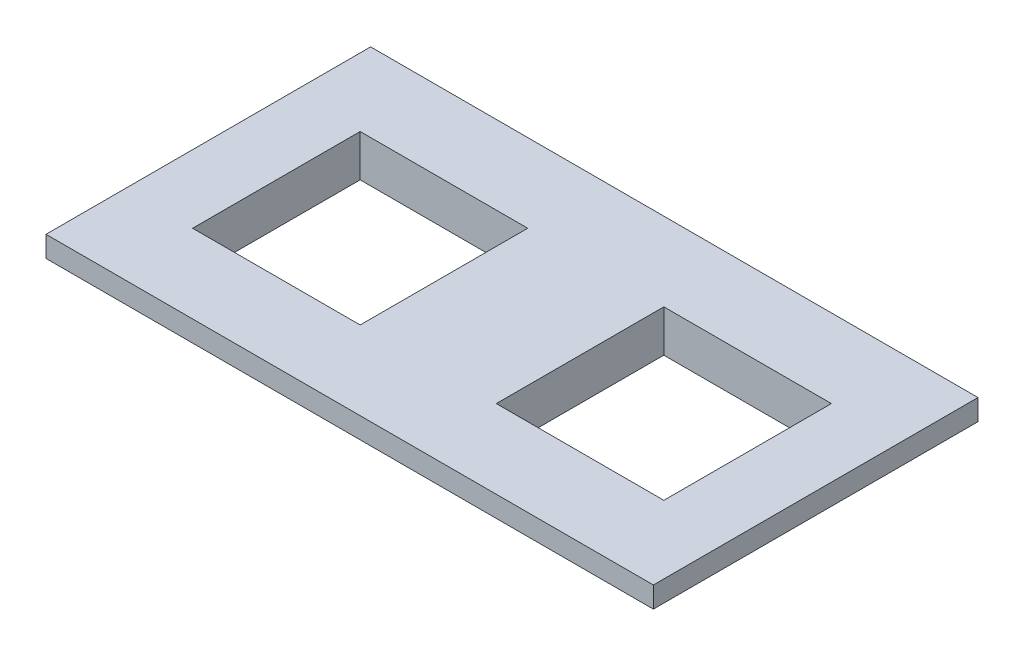
ISO-10303-21;
HEADER;
FILE_DESCRIPTION(('STEP AP214'),'2;1');
FILE_NAME('part.step','',(''),(''),'','','');
FILE_SCHEMA(('AUTOMOTIVE_DESIGN { 1 0 10303 214 1 1 1 1 }'));
ENDSEC;
DATA;
#1=APPLICATION_CONTEXT('core data for automotive mechanical design processes');
#2=APPLICATION_PROTOCOL_DEFINITION('international standard','automotive_design',2000,#1);
#3=PRODUCT_CONTEXT('',#1,'mechanical');
#4=PRODUCT('Part','Part','',(#3));
#5=PRODUCT_RELATED_PRODUCT_CATEGORY('part','',(#4));
#6=PRODUCT_DEFINITION_FORMATION('','',#4);
#7=PRODUCT_DEFINITION_CONTEXT('part definition',#1,'design');
#8=PRODUCT_DEFINITION('design','',#6,#7);
#9=PRODUCT_DEFINITION_SHAPE('','',#8);
#10=(LENGTH_UNIT() NAMED_UNIT(*) SI_UNIT(.MILLI.,.METRE.));
#11=(NAMED_UNIT(*) PLANE_ANGLE_UNIT() SI_UNIT($,.RADIAN.));
#12=(NAMED_UNIT(*) SI_UNIT($,.STERADIAN.) SOLID_ANGLE_UNIT());
#13=UNCERTAINTY_MEASURE_WITH_UNIT(LENGTH_MEASURE(1.E-05),#10,'distance_accuracy_value','');
#14=(GEOMETRIC_REPRESENTATION_CONTEXT(3) GLOBAL_UNCERTAINTY_ASSIGNED_CONTEXT((#13)) GLOBAL_UNIT_ASSIGNED_CONTEXT((#10,
#11,#12)) REPRESENTATION_CONTEXT('',''));
#15=CARTESIAN_POINT('',(0.,0.,0.));
#16=DIRECTION('',(0.,0.,1.));
#17=DIRECTION('',(1.,0.,0.));
#18=AXIS2_PLACEMENT_3D('',#15,#16,#17);
#19=CARTESIAN_POINT('',(-13.5,8.,7.75));
#20=DIRECTION('',(1.,0.,0.));
#21=DIRECTION('',(0.,0.,-1.));
#22=AXIS2_PLACEMENT_3D('',#19,#20,#21);
#23=PLANE('',#22);
#24=DIRECTION('',(0.,-1.,0.));
#25=VECTOR('',#24,1.);
#26=CARTESIAN_POINT('',(-13.5,8.,6.75));
#27=LINE('',#26,#25);
#28=CARTESIAN_POINT('',(-13.5,8.,6.75));
#29=VERTEX_POINT('',#28);
#30=CARTESIAN_POINT('',(-13.5,7.,6.75));
#31=VERTEX_POINT('',#30);
#32=EDGE_CURVE('E305',#29,#31,#27,.T.);
#33=ORIENTED_EDGE('',*,*,#32,.F.);
#34=DIRECTION('',(0.,0.,1.));
#35=VECTOR('',#34,1.);
#36=CARTESIAN_POINT('',(-13.5,8.,0.));
#37=LINE('',#36,#35);
#38=CARTESIAN_POINT('',(-13.5,8.,-6.75));
#39=VERTEX_POINT('',#38);
#40=EDGE_CURVE('E304',#39,#29,#37,.T.);
#41=ORIENTED_EDGE('',*,*,#40,.F.);
#42=DIRECTION('',(0.,-1.,0.));
#43=VECTOR('',#42,1.);
#44=CARTESIAN_POINT('',(-13.5,8.,-6.75));
#45=LINE('',#44,#43);
#46=CARTESIAN_POINT('',(-13.5,7.,-6.75));
#47=VERTEX_POINT('',#46);
#48=EDGE_CURVE('E311',#39,#47,#45,.T.);
#49=ORIENTED_EDGE('',*,*,#48,.T.);
#50=DIRECTION('',(0.,0.,-1.));
#51=VECTOR('',#50,1.);
#52=CARTESIAN_POINT('',(-13.5,7.,7.75));
#53=LINE('',#52,#51);
#54=EDGE_CURVE('E61',#31,#47,#53,.T.);
#55=ORIENTED_EDGE('',*,*,#54,.F.);
#56=EDGE_LOOP('',(#33,#41,#49,#55));
#57=FACE_BOUND('',#56,.T.);
#58=ADVANCED_FACE('F57',(#57),#23,.F.);
#59=CARTESIAN_POINT('',(13.5,8.,7.75000000000001));
#60=DIRECTION('',(-1.,0.,0.));
#61=DIRECTION('',(0.,0.,1.));
#62=AXIS2_PLACEMENT_3D('',#59,#60,#61);
#63=PLANE('',#62);
#64=DIRECTION('',(0.,-1.,0.));
#65=VECTOR('',#64,1.);
#66=CARTESIAN_POINT('',(13.5,8.,-6.75000000000001));
#67=LINE('',#66,#65);
#68=CARTESIAN_POINT('',(13.5,8.,-6.75000000000001));
#69=VERTEX_POINT('',#68);
#70=CARTESIAN_POINT('',(13.5,7.,-6.75000000000001));
#71=VERTEX_POINT('',#70);
#72=EDGE_CURVE('E316',#69,#71,#67,.T.);
#73=ORIENTED_EDGE('',*,*,#72,.F.);
#74=DIRECTION('',(0.,0.,-1.));
#75=VECTOR('',#74,1.);
#76=CARTESIAN_POINT('',(13.5,8.,0.));
#77=LINE('',#76,#75);
#78=CARTESIAN_POINT('',(13.5,8.,6.75000000000001));
#79=VERTEX_POINT('',#78);
#80=EDGE_CURVE('E331',#79,#69,#77,.T.);
#81=ORIENTED_EDGE('',*,*,#80,.F.);
#82=DIRECTION('',(0.,-1.,0.));
#83=VECTOR('',#82,1.);
#84=CARTESIAN_POINT('',(13.5,8.,6.75000000000001));
#85=LINE('',#84,#83);
#86=CARTESIAN_POINT('',(13.5,7.,6.75000000000001));
#87=VERTEX_POINT('',#86);
#88=EDGE_CURVE('E309',#79,#87,#85,.T.);
#89=ORIENTED_EDGE('',*,*,#88,.T.);
#90=DIRECTION('',(0.,0.,1.));
#91=VECTOR('',#90,1.);
#92=CARTESIAN_POINT('',(13.5,7.,7.75000000000001));
#93=LINE('',#92,#91);
#94=EDGE_CURVE('E353',#71,#87,#93,.T.);
#95=ORIENTED_EDGE('',*,*,#94,.F.);
#96=EDGE_LOOP('',(#73,#81,#89,#95));
#97=FACE_BOUND('',#96,.T.);
#98=ADVANCED_FACE('F439',(#97),#63,.F.);
#99=CARTESIAN_POINT('',(-0.500000000000001,8.,-6.75));
#100=DIRECTION('',(1.,0.,0.));
#101=DIRECTION('',(0.,0.,-1.));
#102=AXIS2_PLACEMENT_3D('',#99,#100,#101);
#103=PLANE('',#102);
#104=DIRECTION('',(0.,0.,-1.));
#105=VECTOR('',#104,1.);
#106=CARTESIAN_POINT('',(-0.500000000000001,7.,-6.75));
#107=LINE('',#106,#105);
#108=CARTESIAN_POINT('',(-0.499999999999999,7.,6.75));
#109=VERTEX_POINT('',#108);
#110=CARTESIAN_POINT('',(-0.500000000000001,7.,-6.75));
#111=VERTEX_POINT('',#110);
#112=EDGE_CURVE('E356',#109,#111,#107,.T.);
#113=ORIENTED_EDGE('',*,*,#112,.T.);
#114=DIRECTION('',(0.,-1.,0.));
#115=VECTOR('',#114,1.);
#116=CARTESIAN_POINT('',(-0.500000000000001,8.,-6.75));
#117=LINE('',#116,#115);
#118=CARTESIAN_POINT('',(-0.5,8.,-6.75));
#119=VERTEX_POINT('',#118);
#120=EDGE_CURVE('E300',#119,#111,#117,.T.);
#121=ORIENTED_EDGE('',*,*,#120,.F.);
#122=DIRECTION('',(0.,0.,1.));
#123=VECTOR('',#122,1.);
#124=CARTESIAN_POINT('',(-0.500000000000001,8.,-6.75));
#125=LINE('',#124,#123);
#126=CARTESIAN_POINT('',(-0.5,8.,6.75));
#127=VERTEX_POINT('',#126);
#128=EDGE_CURVE('E11',#119,#127,#125,.T.);
#129=ORIENTED_EDGE('',*,*,#128,.T.);
#130=DIRECTION('',(0.,-1.,0.));
#131=VECTOR('',#130,1.);
#132=CARTESIAN_POINT('',(-0.499999999999999,8.,6.75));
#133=LINE('',#132,#131);
#134=EDGE_CURVE('E296',#127,#109,#133,.T.);
#135=ORIENTED_EDGE('',*,*,#134,.T.);
#136=EDGE_LOOP('',(#113,#121,#129,#135));
#137=FACE_BOUND('',#136,.T.);
#138=ADVANCED_FACE('F418',(#137),#103,.T.);
#139=CARTESIAN_POINT('',(-14.5,8.,6.75));
#140=DIRECTION('',(0.,0.,-1.));
#141=DIRECTION('',(-1.,0.,0.));
#142=AXIS2_PLACEMENT_3D('',#139,#140,#141);
#143=PLANE('',#142);
#144=ORIENTED_EDGE('',*,*,#134,.F.);
#145=DIRECTION('',(1.,0.,0.));
#146=VECTOR('',#145,1.);
#147=CARTESIAN_POINT('',(0.,8.,6.75));
#148=LINE('',#147,#146);
#149=EDGE_CURVE('E330',#29,#127,#148,.T.);
#150=ORIENTED_EDGE('',*,*,#149,.F.);
#151=ORIENTED_EDGE('',*,*,#32,.T.);
#152=DIRECTION('',(-1.,0.,0.));
#153=VECTOR('',#152,1.);
#154=CARTESIAN_POINT('',(-14.5,7.,6.75));
#155=LINE('',#154,#153);
#156=EDGE_CURVE('E393',#109,#31,#155,.T.);
#157=ORIENTED_EDGE('',*,*,#156,.F.);
#158=EDGE_LOOP('',(#144,#150,#151,#157));
#159=FACE_BOUND('',#158,.T.);
#160=ADVANCED_FACE('F408',(#159),#143,.F.);
#161=CARTESIAN_POINT('',(0.5,8.,-6.75000000000001));
#162=DIRECTION('',(-1.,0.,0.));
#163=DIRECTION('',(0.,0.,1.));
#164=AXIS2_PLACEMENT_3D('',#161,#162,#163);
#165=PLANE('',#164);
#166=DIRECTION('',(0.,0.,1.));
#167=VECTOR('',#166,1.);
#168=CARTESIAN_POINT('',(0.5,7.,-6.75000000000001));
#169=LINE('',#168,#167);
#170=CARTESIAN_POINT('',(0.5,7.,-6.75000000000001));
#171=VERTEX_POINT('',#170);
#172=CARTESIAN_POINT('',(0.500000000000001,7.,6.75));
#173=VERTEX_POINT('',#172);
#174=EDGE_CURVE('E310',#171,#173,#169,.T.);
#175=ORIENTED_EDGE('',*,*,#174,.T.);
#176=DIRECTION('',(0.,-1.,0.));
#177=VECTOR('',#176,1.);
#178=CARTESIAN_POINT('',(0.500000000000001,8.,6.75));
#179=LINE('',#178,#177);
#180=CARTESIAN_POINT('',(0.500000000000002,8.,6.75));
#181=VERTEX_POINT('',#180);
#182=EDGE_CURVE('E292',#181,#173,#179,.T.);
#183=ORIENTED_EDGE('',*,*,#182,.F.);
#184=DIRECTION('',(0.,0.,-1.));
#185=VECTOR('',#184,1.);
#186=CARTESIAN_POINT('',(0.5,8.,-6.75000000000001));
#187=LINE('',#186,#185);
#188=CARTESIAN_POINT('',(0.500000000000002,8.,-6.75));
#189=VERTEX_POINT('',#188);
#190=EDGE_CURVE('E67',#181,#189,#187,.T.);
#191=ORIENTED_EDGE('',*,*,#190,.T.);
#192=DIRECTION('',(0.,-1.,0.));
#193=VECTOR('',#192,1.);
#194=CARTESIAN_POINT('',(0.5,8.,-6.75000000000001));
#195=LINE('',#194,#193);
#196=EDGE_CURVE('E288',#189,#171,#195,.T.);
#197=ORIENTED_EDGE('',*,*,#196,.T.);
#198=EDGE_LOOP('',(#175,#183,#191,#197));
#199=FACE_BOUND('',#198,.T.);
#200=ADVANCED_FACE('F432',(#199),#165,.T.);
#201=CARTESIAN_POINT('',(-14.5,8.,-6.75));
#202=DIRECTION('',(0.,0.,1.));
#203=DIRECTION('',(1.,0.,0.));
#204=AXIS2_PLACEMENT_3D('',#201,#202,#203);
#205=PLANE('',#204);
#206=ORIENTED_EDGE('',*,*,#196,.F.);
#207=DIRECTION('',(-1.,0.,0.));
#208=VECTOR('',#207,1.);
#209=CARTESIAN_POINT('',(0.,8.,-6.75));
#210=LINE('',#209,#208);
#211=EDGE_CURVE('E315',#69,#189,#210,.T.);
#212=ORIENTED_EDGE('',*,*,#211,.F.);
#213=ORIENTED_EDGE('',*,*,#72,.T.);
#214=DIRECTION('',(1.,0.,0.));
#215=VECTOR('',#214,1.);
#216=CARTESIAN_POINT('',(-14.5,7.,-6.75));
#217=LINE('',#216,#215);
#218=EDGE_CURVE('E384',#171,#71,#217,.T.);
#219=ORIENTED_EDGE('',*,*,#218,.F.);
#220=EDGE_LOOP('',(#206,#212,#213,#219));
#221=FACE_BOUND('',#220,.T.);
#222=ADVANCED_FACE('F429',(#221),#205,.F.);
#223=CARTESIAN_POINT('',(0.,8.,0.));
#224=DIRECTION('',(0.,-1.,0.));
#225=DIRECTION('',(0.,0.,-1.));
#226=AXIS2_PLACEMENT_3D('',#223,#224,#225);
#227=PLANE('',#226);
#228=EDGE_CURVE('E326',#181,#79,#148,.T.);
#229=ORIENTED_EDGE('',*,*,#228,.T.);
#230=ORIENTED_EDGE('',*,*,#80,.T.);
#231=ORIENTED_EDGE('',*,*,#211,.T.);
#232=ORIENTED_EDGE('',*,*,#190,.F.);
#233=EDGE_LOOP('',(#229,#230,#231,#232));
#234=FACE_BOUND('',#233,.T.);
#235=DIRECTION('',(0.,0.,1.));
#236=VECTOR('',#235,1.);
#237=CARTESIAN_POINT('',(-14.5,8.,7.75));
#238=LINE('',#237,#236);
#239=CARTESIAN_POINT('',(-14.5,8.,-7.75));
#240=VERTEX_POINT('',#239);
#241=CARTESIAN_POINT('',(-14.5,8.,7.75));
#242=VERTEX_POINT('',#241);
#243=EDGE_CURVE('E339',#240,#242,#238,.T.);
#244=ORIENTED_EDGE('',*,*,#243,.F.);
#245=DIRECTION('',(-1.,0.,0.));
#246=VECTOR('',#245,1.);
#247=CARTESIAN_POINT('',(-14.5,8.,-7.75));
#248=LINE('',#247,#246);
#249=CARTESIAN_POINT('',(14.5,8.,-7.75000000000001));
#250=VERTEX_POINT('',#249);
#251=EDGE_CURVE('E350',#250,#240,#248,.T.);
#252=ORIENTED_EDGE('',*,*,#251,.F.);
#253=DIRECTION('',(0.,0.,-1.));
#254=VECTOR('',#253,1.);
#255=CARTESIAN_POINT('',(14.5,8.,7.75000000000001));
#256=LINE('',#255,#254);
#257=CARTESIAN_POINT('',(14.5,8.,7.75000000000001));
#258=VERTEX_POINT('',#257);
#259=EDGE_CURVE('E347',#258,#250,#256,.T.);
#260=ORIENTED_EDGE('',*,*,#259,.F.);
#261=DIRECTION('',(1.,0.,0.));
#262=VECTOR('',#261,1.);
#263=CARTESIAN_POINT('',(-14.5,8.,7.75));
#264=LINE('',#263,#262);
#265=EDGE_CURVE('E343',#242,#258,#264,.T.);
#266=ORIENTED_EDGE('',*,*,#265,.F.);
#267=EDGE_LOOP('',(#244,#252,#260,#266));
#268=FACE_BOUND('',#267,.T.);
#269=ORIENTED_EDGE('',*,*,#40,.T.);
#270=ORIENTED_EDGE('',*,*,#149,.T.);
#271=ORIENTED_EDGE('',*,*,#128,.F.);
#272=EDGE_CURVE('E335',#119,#39,#210,.T.);
#273=ORIENTED_EDGE('',*,*,#272,.T.);
#274=EDGE_LOOP('',(#269,#270,#271,#273));
#275=FACE_BOUND('',#274,.T.);
#276=ADVANCED_FACE('F420',(#234,#268,#275),#227,.T.);
#277=ORIENTED_EDGE('',*,*,#88,.F.);
#278=ORIENTED_EDGE('',*,*,#228,.F.);
#279=ORIENTED_EDGE('',*,*,#182,.T.);
#280=DIRECTION('',(-1.,0.,0.));
#281=VECTOR('',#280,1.);
#282=CARTESIAN_POINT('',(-14.5,7.,6.75));
#283=LINE('',#282,#281);
#284=EDGE_CURVE('E389',#87,#173,#283,.T.);
#285=ORIENTED_EDGE('',*,*,#284,.F.);
#286=EDGE_LOOP('',(#277,#278,#279,#285));
#287=FACE_BOUND('',#286,.T.);
#288=ADVANCED_FACE('F437',(#287),#143,.F.);
#289=ORIENTED_EDGE('',*,*,#48,.F.);
#290=ORIENTED_EDGE('',*,*,#272,.F.);
#291=ORIENTED_EDGE('',*,*,#120,.T.);
#292=DIRECTION('',(1.,0.,0.));
#293=VECTOR('',#292,1.);
#294=CARTESIAN_POINT('',(-14.5,7.,-6.75));
#295=LINE('',#294,#293);
#296=EDGE_CURVE('E388',#47,#111,#295,.T.);
#297=ORIENTED_EDGE('',*,*,#296,.F.);
#298=EDGE_LOOP('',(#289,#290,#291,#297));
#299=FACE_BOUND('',#298,.T.);
#300=ADVANCED_FACE('F415',(#299),#205,.F.);
#301=CARTESIAN_POINT('',(-14.5,7.,-7.75));
#302=DIRECTION('',(0.,-1.,0.));
#303=DIRECTION('',(0.,0.,-1.));
#304=AXIS2_PLACEMENT_3D('',#301,#302,#303);
#305=PLANE('',#304);
#306=DIRECTION('',(0.,0.,1.));
#307=VECTOR('',#306,1.);
#308=CARTESIAN_POINT('',(11.25,7.,-7.75));
#309=LINE('',#308,#307);
#310=CARTESIAN_POINT('',(11.25,7.,-4.));
#311=VERTEX_POINT('',#310);
#312=CARTESIAN_POINT('',(11.25,7.,4.));
#313=VERTEX_POINT('',#312);
#314=EDGE_CURVE('E270',#311,#313,#309,.T.);
#315=ORIENTED_EDGE('',*,*,#314,.F.);
#316=DIRECTION('',(1.,0.,0.));
#317=VECTOR('',#316,1.);
#318=CARTESIAN_POINT('',(-14.5,7.,-4.));
#319=LINE('',#318,#317);
#320=CARTESIAN_POINT('',(3.25,7.,-4.));
#321=VERTEX_POINT('',#320);
#322=EDGE_CURVE('E231',#321,#311,#319,.T.);
#323=ORIENTED_EDGE('',*,*,#322,.F.);
#324=DIRECTION('',(0.,0.,-1.));
#325=VECTOR('',#324,1.);
#326=CARTESIAN_POINT('',(3.25,7.,-7.75));
#327=LINE('',#326,#325);
#328=CARTESIAN_POINT('',(3.25,7.,4.));
#329=VERTEX_POINT('',#328);
#330=EDGE_CURVE('E264',#329,#321,#327,.T.);
#331=ORIENTED_EDGE('',*,*,#330,.F.);
#332=DIRECTION('',(-1.,0.,0.));
#333=VECTOR('',#332,1.);
#334=CARTESIAN_POINT('',(-14.5,7.,4.));
#335=LINE('',#334,#333);
#336=EDGE_CURVE('E267',#313,#329,#335,.T.);
#337=ORIENTED_EDGE('',*,*,#336,.F.);
#338=EDGE_LOOP('',(#315,#323,#331,#337));
#339=FACE_BOUND('',#338,.T.);
#340=ORIENTED_EDGE('',*,*,#218,.T.);
#341=ORIENTED_EDGE('',*,*,#94,.T.);
#342=ORIENTED_EDGE('',*,*,#284,.T.);
#343=ORIENTED_EDGE('',*,*,#174,.F.);
#344=EDGE_LOOP('',(#340,#341,#342,#343));
#345=FACE_BOUND('',#344,.T.);
#346=ADVANCED_FACE('F441',(#339,#345),#305,.T.);
#347=DIRECTION('',(0.,0.,1.));
#348=VECTOR('',#347,1.);
#349=CARTESIAN_POINT('',(-3.25,7.,-7.75));
#350=LINE('',#349,#348);
#351=CARTESIAN_POINT('',(-3.25,7.,-4.));
#352=VERTEX_POINT('',#351);
#353=CARTESIAN_POINT('',(-3.25,7.,4.));
#354=VERTEX_POINT('',#353);
#355=EDGE_CURVE('E281',#352,#354,#350,.T.);
#356=ORIENTED_EDGE('',*,*,#355,.F.);
#357=DIRECTION('',(1.,0.,0.));
#358=VECTOR('',#357,1.);
#359=CARTESIAN_POINT('',(-14.5,7.,-4.));
#360=LINE('',#359,#358);
#361=CARTESIAN_POINT('',(-11.25,7.,-4.));
#362=VERTEX_POINT('',#361);
#363=EDGE_CURVE('E273',#362,#352,#360,.T.);
#364=ORIENTED_EDGE('',*,*,#363,.F.);
#365=DIRECTION('',(0.,0.,-1.));
#366=VECTOR('',#365,1.);
#367=CARTESIAN_POINT('',(-11.25,7.,-7.75));
#368=LINE('',#367,#366);
#369=CARTESIAN_POINT('',(-11.25,7.,4.));
#370=VERTEX_POINT('',#369);
#371=EDGE_CURVE('E202',#370,#362,#368,.T.);
#372=ORIENTED_EDGE('',*,*,#371,.F.);
#373=DIRECTION('',(-1.,0.,0.));
#374=VECTOR('',#373,1.);
#375=CARTESIAN_POINT('',(-14.5,7.,4.));
#376=LINE('',#375,#374);
#377=EDGE_CURVE('E278',#354,#370,#376,.T.);
#378=ORIENTED_EDGE('',*,*,#377,.F.);
#379=EDGE_LOOP('',(#356,#364,#372,#378));
#380=FACE_BOUND('',#379,.T.);
#381=ORIENTED_EDGE('',*,*,#156,.T.);
#382=ORIENTED_EDGE('',*,*,#54,.T.);
#383=ORIENTED_EDGE('',*,*,#296,.T.);
#384=ORIENTED_EDGE('',*,*,#112,.F.);
#385=EDGE_LOOP('',(#381,#382,#383,#384));
#386=FACE_BOUND('',#385,.T.);
#387=ADVANCED_FACE('F404',(#380,#386),#305,.T.);
#388=CARTESIAN_POINT('',(0.,0.,7.75));
#389=DIRECTION('',(0.,0.,1.));
#390=DIRECTION('',(1.,0.,0.));
#391=AXIS2_PLACEMENT_3D('',#388,#389,#390);
#392=PLANE('',#391);
#393=DIRECTION('',(0.,-1.,0.));
#394=VECTOR('',#393,1.);
#395=CARTESIAN_POINT('',(-14.5,9.,7.75));
#396=LINE('',#395,#394);
#397=CARTESIAN_POINT('',(-14.5,9.,7.75));
#398=VERTEX_POINT('',#397);
#399=EDGE_CURVE('E283',#398,#242,#396,.T.);
#400=ORIENTED_EDGE('',*,*,#399,.T.);
#401=ORIENTED_EDGE('',*,*,#265,.T.);
#402=DIRECTION('',(0.,1.,0.));
#403=VECTOR('',#402,1.);
#404=CARTESIAN_POINT('',(14.5,9.,7.75));
#405=LINE('',#404,#403);
#406=CARTESIAN_POINT('',(14.5,9.,7.75));
#407=VERTEX_POINT('',#406);
#408=EDGE_CURVE('E373',#258,#407,#405,.T.);
#409=ORIENTED_EDGE('',*,*,#408,.T.);
#410=DIRECTION('',(-1.,0.,0.));
#411=VECTOR('',#410,1.);
#412=CARTESIAN_POINT('',(-14.5,9.,7.75));
#413=LINE('',#412,#411);
#414=EDGE_CURVE('E362',#407,#398,#413,.T.);
#415=ORIENTED_EDGE('',*,*,#414,.T.);
#416=EDGE_LOOP('',(#400,#401,#409,#415));
#417=FACE_BOUND('',#416,.T.);
#418=ADVANCED_FACE('F449',(#417),#392,.T.);
#419=CARTESIAN_POINT('',(-14.5,9.,-7.75));
#420=DIRECTION('',(0.,1.,0.));
#421=DIRECTION('',(0.,0.,1.));
#422=AXIS2_PLACEMENT_3D('',#419,#420,#421);
#423=PLANE('',#422);
#424=DIRECTION('',(0.,0.,-1.));
#425=VECTOR('',#424,1.);
#426=CARTESIAN_POINT('',(-3.25,9.,4.));
#427=LINE('',#426,#425);
#428=CARTESIAN_POINT('',(-3.25,9.,4.));
#429=VERTEX_POINT('',#428);
#430=CARTESIAN_POINT('',(-3.25,9.,-4.));
#431=VERTEX_POINT('',#430);
#432=EDGE_CURVE('E216',#429,#431,#427,.T.);
#433=ORIENTED_EDGE('',*,*,#432,.F.);
#434=DIRECTION('',(1.,0.,0.));
#435=VECTOR('',#434,1.);
#436=CARTESIAN_POINT('',(-11.25,9.,4.));
#437=LINE('',#436,#435);
#438=CARTESIAN_POINT('',(-11.25,9.,4.));
#439=VERTEX_POINT('',#438);
#440=EDGE_CURVE('E221',#439,#429,#437,.T.);
#441=ORIENTED_EDGE('',*,*,#440,.F.);
#442=DIRECTION('',(0.,0.,1.));
#443=VECTOR('',#442,1.);
#444=CARTESIAN_POINT('',(-11.25,9.,4.));
#445=LINE('',#444,#443);
#446=CARTESIAN_POINT('',(-11.25,9.,-4.));
#447=VERTEX_POINT('',#446);
#448=EDGE_CURVE('E199',#447,#439,#445,.T.);
#449=ORIENTED_EDGE('',*,*,#448,.F.);
#450=DIRECTION('',(-1.,0.,0.));
#451=VECTOR('',#450,1.);
#452=CARTESIAN_POINT('',(-11.25,9.,-4.));
#453=LINE('',#452,#451);
#454=EDGE_CURVE('E210',#431,#447,#453,.T.);
#455=ORIENTED_EDGE('',*,*,#454,.F.);
#456=EDGE_LOOP('',(#433,#441,#449,#455));
#457=FACE_BOUND('',#456,.T.);
#458=DIRECTION('',(0.,0.,-1.));
#459=VECTOR('',#458,1.);
#460=CARTESIAN_POINT('',(11.25,9.,4.));
#461=LINE('',#460,#459);
#462=CARTESIAN_POINT('',(11.25,9.,4.));
#463=VERTEX_POINT('',#462);
#464=CARTESIAN_POINT('',(11.25,9.,-4.));
#465=VERTEX_POINT('',#464);
#466=EDGE_CURVE('E236',#463,#465,#461,.T.);
#467=ORIENTED_EDGE('',*,*,#466,.F.);
#468=DIRECTION('',(1.,0.,0.));
#469=VECTOR('',#468,1.);
#470=CARTESIAN_POINT('',(3.25,9.,4.));
#471=LINE('',#470,#469);
#472=CARTESIAN_POINT('',(3.25,9.,4.));
#473=VERTEX_POINT('',#472);
#474=EDGE_CURVE('E246',#473,#463,#471,.T.);
#475=ORIENTED_EDGE('',*,*,#474,.F.);
#476=DIRECTION('',(0.,0.,1.));
#477=VECTOR('',#476,1.);
#478=CARTESIAN_POINT('',(3.25,9.,4.));
#479=LINE('',#478,#477);
#480=CARTESIAN_POINT('',(3.25,9.,-4.));
#481=VERTEX_POINT('',#480);
#482=EDGE_CURVE('E242',#481,#473,#479,.T.);
#483=ORIENTED_EDGE('',*,*,#482,.F.);
#484=DIRECTION('',(-1.,0.,0.));
#485=VECTOR('',#484,1.);
#486=CARTESIAN_POINT('',(3.25,9.,-4.));
#487=LINE('',#486,#485);
#488=EDGE_CURVE('E239',#465,#481,#487,.T.);
#489=ORIENTED_EDGE('',*,*,#488,.F.);
#490=EDGE_LOOP('',(#467,#475,#483,#489));
#491=FACE_BOUND('',#490,.T.);
#492=ORIENTED_EDGE('',*,*,#414,.F.);
#493=DIRECTION('',(0.,0.,1.));
#494=VECTOR('',#493,1.);
#495=CARTESIAN_POINT('',(14.5,9.,-7.75));
#496=LINE('',#495,#494);
#497=CARTESIAN_POINT('',(14.5,9.,-7.75));
#498=VERTEX_POINT('',#497);
#499=EDGE_CURVE('E369',#498,#407,#496,.T.);
#500=ORIENTED_EDGE('',*,*,#499,.F.);
#501=DIRECTION('',(-1.,0.,0.));
#502=VECTOR('',#501,1.);
#503=CARTESIAN_POINT('',(-14.5,9.,-7.75));
#504=LINE('',#503,#502);
#505=CARTESIAN_POINT('',(-14.5,9.,-7.75));
#506=VERTEX_POINT('',#505);
#507=EDGE_CURVE('E365',#498,#506,#504,.T.);
#508=ORIENTED_EDGE('',*,*,#507,.T.);
#509=DIRECTION('',(0.,0.,1.));
#510=VECTOR('',#509,1.);
#511=CARTESIAN_POINT('',(-14.5,9.,-7.75));
#512=LINE('',#511,#510);
#513=EDGE_CURVE('E344',#506,#398,#512,.T.);
#514=ORIENTED_EDGE('',*,*,#513,.T.);
#515=EDGE_LOOP('',(#492,#500,#508,#514));
#516=FACE_BOUND('',#515,.T.);
#517=ADVANCED_FACE('F218',(#457,#491,#516),#423,.T.);
#518=CARTESIAN_POINT('',(-14.5,9.,-7.75));
#519=DIRECTION('',(-1.,0.,0.));
#520=DIRECTION('',(0.,0.,1.));
#521=AXIS2_PLACEMENT_3D('',#518,#519,#520);
#522=PLANE('',#521);
#523=DIRECTION('',(0.,-1.,0.));
#524=VECTOR('',#523,1.);
#525=CARTESIAN_POINT('',(-14.5,9.,-7.75));
#526=LINE('',#525,#524);
#527=EDGE_CURVE('E357',#506,#240,#526,.T.);
#528=ORIENTED_EDGE('',*,*,#527,.T.);
#529=ORIENTED_EDGE('',*,*,#243,.T.);
#530=ORIENTED_EDGE('',*,*,#399,.F.);
#531=ORIENTED_EDGE('',*,*,#513,.F.);
#532=EDGE_LOOP('',(#528,#529,#530,#531));
#533=FACE_BOUND('',#532,.T.);
#534=ADVANCED_FACE('F59',(#533),#522,.T.);
#535=CARTESIAN_POINT('',(14.5,9.,-7.75));
#536=DIRECTION('',(1.,0.,0.));
#537=DIRECTION('',(0.,0.,-1.));
#538=AXIS2_PLACEMENT_3D('',#535,#536,#537);
#539=PLANE('',#538);
#540=ORIENTED_EDGE('',*,*,#408,.F.);
#541=ORIENTED_EDGE('',*,*,#259,.T.);
#542=DIRECTION('',(0.,1.,0.));
#543=VECTOR('',#542,1.);
#544=CARTESIAN_POINT('',(14.5,9.,-7.75));
#545=LINE('',#544,#543);
#546=EDGE_CURVE('E361',#250,#498,#545,.T.);
#547=ORIENTED_EDGE('',*,*,#546,.T.);
#548=ORIENTED_EDGE('',*,*,#499,.T.);
#549=EDGE_LOOP('',(#540,#541,#547,#548));
#550=FACE_BOUND('',#549,.T.);
#551=ADVANCED_FACE('F475',(#550),#539,.T.);
#552=CARTESIAN_POINT('',(0.,0.,-7.75));
#553=DIRECTION('',(0.,0.,1.));
#554=DIRECTION('',(1.,0.,0.));
#555=AXIS2_PLACEMENT_3D('',#552,#553,#554);
#556=PLANE('',#555);
#557=ORIENTED_EDGE('',*,*,#546,.F.);
#558=ORIENTED_EDGE('',*,*,#251,.T.);
#559=ORIENTED_EDGE('',*,*,#527,.F.);
#560=ORIENTED_EDGE('',*,*,#507,.F.);
#561=EDGE_LOOP('',(#557,#558,#559,#560));
#562=FACE_BOUND('',#561,.T.);
#563=ADVANCED_FACE('F453',(#562),#556,.F.);
#564=CARTESIAN_POINT('',(11.25,-6.5,4.));
#565=DIRECTION('',(1.,0.,0.));
#566=DIRECTION('',(0.,0.,-1.));
#567=AXIS2_PLACEMENT_3D('',#564,#565,#566);
#568=PLANE('',#567);
#569=ORIENTED_EDGE('',*,*,#314,.T.);
#570=DIRECTION('',(0.,1.,0.));
#571=VECTOR('',#570,1.);
#572=CARTESIAN_POINT('',(11.25,-6.5,4.));
#573=LINE('',#572,#571);
#574=EDGE_CURVE('E251',#313,#463,#573,.T.);
#575=ORIENTED_EDGE('',*,*,#574,.T.);
#576=ORIENTED_EDGE('',*,*,#466,.T.);
#577=DIRECTION('',(0.,1.,0.));
#578=VECTOR('',#577,1.);
#579=CARTESIAN_POINT('',(11.25,-6.5,-4.));
#580=LINE('',#579,#578);
#581=EDGE_CURVE('E250',#311,#465,#580,.T.);
#582=ORIENTED_EDGE('',*,*,#581,.F.);
#583=EDGE_LOOP('',(#569,#575,#576,#582));
#584=FACE_BOUND('',#583,.T.);
#585=ADVANCED_FACE('F444',(#584),#568,.F.);
#586=CARTESIAN_POINT('',(3.25,-6.5,4.));
#587=DIRECTION('',(0.,0.,1.));
#588=DIRECTION('',(1.,0.,0.));
#589=AXIS2_PLACEMENT_3D('',#586,#587,#588);
#590=PLANE('',#589);
#591=ORIENTED_EDGE('',*,*,#336,.T.);
#592=DIRECTION('',(0.,1.,0.));
#593=VECTOR('',#592,1.);
#594=CARTESIAN_POINT('',(3.25,-6.5,4.));
#595=LINE('',#594,#593);
#596=EDGE_CURVE('E254',#329,#473,#595,.T.);
#597=ORIENTED_EDGE('',*,*,#596,.T.);
#598=ORIENTED_EDGE('',*,*,#474,.T.);
#599=ORIENTED_EDGE('',*,*,#574,.F.);
#600=EDGE_LOOP('',(#591,#597,#598,#599));
#601=FACE_BOUND('',#600,.T.);
#602=ADVANCED_FACE('F457',(#601),#590,.F.);
#603=CARTESIAN_POINT('',(3.25,-6.5,4.));
#604=DIRECTION('',(-1.,0.,0.));
#605=DIRECTION('',(0.,0.,1.));
#606=AXIS2_PLACEMENT_3D('',#603,#604,#605);
#607=PLANE('',#606);
#608=ORIENTED_EDGE('',*,*,#330,.T.);
#609=DIRECTION('',(0.,1.,0.));
#610=VECTOR('',#609,1.);
#611=CARTESIAN_POINT('',(3.25,-6.5,-4.));
#612=LINE('',#611,#610);
#613=EDGE_CURVE('E75',#321,#481,#612,.T.);
#614=ORIENTED_EDGE('',*,*,#613,.T.);
#615=ORIENTED_EDGE('',*,*,#482,.T.);
#616=ORIENTED_EDGE('',*,*,#596,.F.);
#617=EDGE_LOOP('',(#608,#614,#615,#616));
#618=FACE_BOUND('',#617,.T.);
#619=ADVANCED_FACE('F591',(#618),#607,.F.);
#620=CARTESIAN_POINT('',(3.25,-6.5,-4.));
#621=DIRECTION('',(0.,0.,-1.));
#622=DIRECTION('',(-1.,0.,0.));
#623=AXIS2_PLACEMENT_3D('',#620,#621,#622);
#624=PLANE('',#623);
#625=ORIENTED_EDGE('',*,*,#322,.T.);
#626=ORIENTED_EDGE('',*,*,#581,.T.);
#627=ORIENTED_EDGE('',*,*,#488,.T.);
#628=ORIENTED_EDGE('',*,*,#613,.F.);
#629=EDGE_LOOP('',(#625,#626,#627,#628));
#630=FACE_BOUND('',#629,.T.);
#631=ADVANCED_FACE('F587',(#630),#624,.F.);
#632=CARTESIAN_POINT('',(-3.25,-6.5,4.));
#633=DIRECTION('',(1.,0.,0.));
#634=DIRECTION('',(0.,0.,-1.));
#635=AXIS2_PLACEMENT_3D('',#632,#633,#634);
#636=PLANE('',#635);
#637=ORIENTED_EDGE('',*,*,#355,.T.);
#638=DIRECTION('',(0.,1.,0.));
#639=VECTOR('',#638,1.);
#640=CARTESIAN_POINT('',(-3.25,-6.5,4.));
#641=LINE('',#640,#639);
#642=EDGE_CURVE('E228',#354,#429,#641,.T.);
#643=ORIENTED_EDGE('',*,*,#642,.T.);
#644=ORIENTED_EDGE('',*,*,#432,.T.);
#645=DIRECTION('',(0.,1.,0.));
#646=VECTOR('',#645,1.);
#647=CARTESIAN_POINT('',(-3.25,-6.5,-4.));
#648=LINE('',#647,#646);
#649=EDGE_CURVE('E206',#352,#431,#648,.T.);
#650=ORIENTED_EDGE('',*,*,#649,.F.);
#651=EDGE_LOOP('',(#637,#643,#644,#650));
#652=FACE_BOUND('',#651,.T.);
#653=ADVANCED_FACE('F590',(#652),#636,.F.);
#654=CARTESIAN_POINT('',(-11.25,-6.5,4.));
#655=DIRECTION('',(0.,0.,1.));
#656=DIRECTION('',(1.,0.,0.));
#657=AXIS2_PLACEMENT_3D('',#654,#655,#656);
#658=PLANE('',#657);
#659=ORIENTED_EDGE('',*,*,#377,.T.);
#660=DIRECTION('',(0.,1.,0.));
#661=VECTOR('',#660,1.);
#662=CARTESIAN_POINT('',(-11.25,-6.5,4.));
#663=LINE('',#662,#661);
#664=EDGE_CURVE('E205',#370,#439,#663,.T.);
#665=ORIENTED_EDGE('',*,*,#664,.T.);
#666=ORIENTED_EDGE('',*,*,#440,.T.);
#667=ORIENTED_EDGE('',*,*,#642,.F.);
#668=EDGE_LOOP('',(#659,#665,#666,#667));
#669=FACE_BOUND('',#668,.T.);
#670=ADVANCED_FACE('F600',(#669),#658,.F.);
#671=CARTESIAN_POINT('',(-11.25,-6.5,4.));
#672=DIRECTION('',(-1.,0.,0.));
#673=DIRECTION('',(0.,0.,1.));
#674=AXIS2_PLACEMENT_3D('',#671,#672,#673);
#675=PLANE('',#674);
#676=ORIENTED_EDGE('',*,*,#371,.T.);
#677=DIRECTION('',(0.,1.,0.));
#678=VECTOR('',#677,1.);
#679=CARTESIAN_POINT('',(-11.25,-6.5,-4.));
#680=LINE('',#679,#678);
#681=EDGE_CURVE('E83',#362,#447,#680,.T.);
#682=ORIENTED_EDGE('',*,*,#681,.T.);
#683=ORIENTED_EDGE('',*,*,#448,.T.);
#684=ORIENTED_EDGE('',*,*,#664,.F.);
#685=EDGE_LOOP('',(#676,#682,#683,#684));
#686=FACE_BOUND('',#685,.T.);
#687=ADVANCED_FACE('F196',(#686),#675,.F.);
#688=CARTESIAN_POINT('',(-11.25,-6.5,-4.));
#689=DIRECTION('',(0.,0.,-1.));
#690=DIRECTION('',(-1.,0.,0.));
#691=AXIS2_PLACEMENT_3D('',#688,#689,#690);
#692=PLANE('',#691);
#693=ORIENTED_EDGE('',*,*,#363,.T.);
#694=ORIENTED_EDGE('',*,*,#649,.T.);
#695=ORIENTED_EDGE('',*,*,#454,.T.);
#696=ORIENTED_EDGE('',*,*,#681,.F.);
#697=EDGE_LOOP('',(#693,#694,#695,#696));
#698=FACE_BOUND('',#697,.T.);
#699=ADVANCED_FACE('F211',(#698),#692,.F.);
#700=CLOSED_SHELL('',(#58,#98,#138,#160,#200,#222,#276,#288,#300,#346,#387,#418,#517,#534,#551,
#563,#585,#602,#619,#631,#653,#670,#687,#699));
#701=MANIFOLD_SOLID_BREP('B2',#700);
#702=ADVANCED_BREP_SHAPE_REPRESENTATION('',(#18,#701),#14);
#703=SHAPE_DEFINITION_REPRESENTATION(#9,#702);
ENDSEC;
END-ISO-10303-21;
